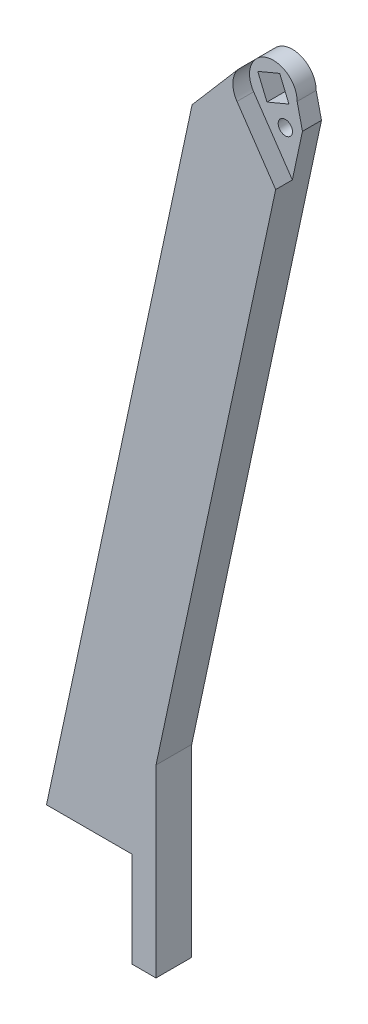
ISO-10303-21;
HEADER;
FILE_DESCRIPTION(('STEP AP214'),'2;1');
FILE_NAME('part.step','',(''),(''),'','','');
FILE_SCHEMA(('AUTOMOTIVE_DESIGN { 1 0 10303 214 1 1 1 1 }'));
ENDSEC;
DATA;
#1=APPLICATION_CONTEXT('core data for automotive mechanical design processes');
#2=APPLICATION_PROTOCOL_DEFINITION('international standard','automotive_design',2000,#1);
#3=PRODUCT_CONTEXT('',#1,'mechanical');
#4=PRODUCT('Part','Part','',(#3));
#5=PRODUCT_RELATED_PRODUCT_CATEGORY('part','',(#4));
#6=PRODUCT_DEFINITION_FORMATION('','',#4);
#7=PRODUCT_DEFINITION_CONTEXT('part definition',#1,'design');
#8=PRODUCT_DEFINITION('design','',#6,#7);
#9=PRODUCT_DEFINITION_SHAPE('','',#8);
#10=(LENGTH_UNIT() NAMED_UNIT(*) SI_UNIT(.MILLI.,.METRE.));
#11=(NAMED_UNIT(*) PLANE_ANGLE_UNIT() SI_UNIT($,.RADIAN.));
#12=(NAMED_UNIT(*) SI_UNIT($,.STERADIAN.) SOLID_ANGLE_UNIT());
#13=UNCERTAINTY_MEASURE_WITH_UNIT(LENGTH_MEASURE(1.E-05),#10,'distance_accuracy_value','');
#14=(GEOMETRIC_REPRESENTATION_CONTEXT(3) GLOBAL_UNCERTAINTY_ASSIGNED_CONTEXT((#13)) GLOBAL_UNIT_ASSIGNED_CONTEXT((#10,
#11,#12)) REPRESENTATION_CONTEXT('',''));
#15=CARTESIAN_POINT('',(0.,0.,0.));
#16=DIRECTION('',(0.,0.,1.));
#17=DIRECTION('',(1.,0.,0.));
#18=AXIS2_PLACEMENT_3D('',#15,#16,#17);
#19=CARTESIAN_POINT('',(6.35,0.,-9.525));
#20=DIRECTION('',(0.,1.,0.));
#21=DIRECTION('',(0.,0.,-1.));
#22=AXIS2_PLACEMENT_3D('',#19,#20,#21);
#23=PLANE('',#22);
#24=DIRECTION('',(1.,0.,0.));
#25=VECTOR('',#24,1.);
#26=CARTESIAN_POINT('',(6.35,0.,0.));
#27=LINE('',#26,#25);
#28=CARTESIAN_POINT('',(0.,0.,0.));
#29=VERTEX_POINT('',#28);
#30=CARTESIAN_POINT('',(6.35,0.,0.));
#31=VERTEX_POINT('',#30);
#32=EDGE_CURVE('E218',#29,#31,#27,.T.);
#33=ORIENTED_EDGE('',*,*,#32,.F.);
#34=DIRECTION('',(0.,0.,1.));
#35=VECTOR('',#34,1.);
#36=CARTESIAN_POINT('',(0.,0.,-9.525));
#37=LINE('',#36,#35);
#38=CARTESIAN_POINT('',(0.,0.,-9.525));
#39=VERTEX_POINT('',#38);
#40=EDGE_CURVE('E246',#39,#29,#37,.T.);
#41=ORIENTED_EDGE('',*,*,#40,.F.);
#42=DIRECTION('',(1.,0.,0.));
#43=VECTOR('',#42,1.);
#44=CARTESIAN_POINT('',(6.35,0.,-9.525));
#45=LINE('',#44,#43);
#46=CARTESIAN_POINT('',(6.35,0.,-9.525));
#47=VERTEX_POINT('',#46);
#48=EDGE_CURVE('E219',#39,#47,#45,.T.);
#49=ORIENTED_EDGE('',*,*,#48,.T.);
#50=DIRECTION('',(0.,0.,1.));
#51=VECTOR('',#50,1.);
#52=CARTESIAN_POINT('',(6.35,0.,-9.525));
#53=LINE('',#52,#51);
#54=EDGE_CURVE('E11',#47,#31,#53,.T.);
#55=ORIENTED_EDGE('',*,*,#54,.T.);
#56=EDGE_LOOP('',(#33,#41,#49,#55));
#57=FACE_BOUND('',#56,.T.);
#58=ADVANCED_FACE('F43',(#57),#23,.F.);
#59=CARTESIAN_POINT('',(6.34999999999999,49.1945665449002,-9.525));
#60=DIRECTION('',(-1.,0.,0.));
#61=DIRECTION('',(0.,-1.,0.));
#62=AXIS2_PLACEMENT_3D('',#59,#60,#61);
#63=PLANE('',#62);
#64=DIRECTION('',(0.,1.,0.));
#65=VECTOR('',#64,1.);
#66=CARTESIAN_POINT('',(6.34999999999999,49.1945665449002,0.));
#67=LINE('',#66,#65);
#68=CARTESIAN_POINT('',(6.34999999999999,49.1945665449002,0.));
#69=VERTEX_POINT('',#68);
#70=EDGE_CURVE('E249',#31,#69,#67,.T.);
#71=ORIENTED_EDGE('',*,*,#70,.F.);
#72=ORIENTED_EDGE('',*,*,#54,.F.);
#73=DIRECTION('',(0.,1.,0.));
#74=VECTOR('',#73,1.);
#75=CARTESIAN_POINT('',(6.34999999999999,49.1945665449002,-9.525));
#76=LINE('',#75,#74);
#77=CARTESIAN_POINT('',(6.34999999999999,49.1945665449002,-9.525));
#78=VERTEX_POINT('',#77);
#79=EDGE_CURVE('E222',#47,#78,#76,.T.);
#80=ORIENTED_EDGE('',*,*,#79,.T.);
#81=DIRECTION('',(0.,0.,1.));
#82=VECTOR('',#81,1.);
#83=CARTESIAN_POINT('',(6.34999999999999,49.1945665449002,-9.525));
#84=LINE('',#83,#82);
#85=EDGE_CURVE('E50',#78,#69,#84,.T.);
#86=ORIENTED_EDGE('',*,*,#85,.T.);
#87=EDGE_LOOP('',(#71,#72,#80,#86));
#88=FACE_BOUND('',#87,.T.);
#89=ADVANCED_FACE('F287',(#88),#63,.F.);
#90=CARTESIAN_POINT('',(6.34999999999999,49.1945665449002,-9.525));
#91=DIRECTION('',(-0.977784225170926,0.20961395231924,0.));
#92=DIRECTION('',(-0.20961395231924,-0.977784225170926,0.));
#93=AXIS2_PLACEMENT_3D('',#90,#91,#92);
#94=PLANE('',#93);
#95=DIRECTION('',(0.,0.,1.));
#96=VECTOR('',#95,1.);
#97=CARTESIAN_POINT('',(38.2701193709427,198.09204613131,-33.258448319209));
#98=LINE('',#97,#96);
#99=CARTESIAN_POINT('',(38.2701193709427,198.09204613131,-4.445));
#100=VERTEX_POINT('',#99);
#101=CARTESIAN_POINT('',(38.2701193709427,198.09204613131,0.));
#102=VERTEX_POINT('',#101);
#103=EDGE_CURVE('E206',#100,#102,#98,.T.);
#104=ORIENTED_EDGE('',*,*,#103,.T.);
#105=DIRECTION('',(0.20961395231924,0.977784225170926,0.));
#106=VECTOR('',#105,1.);
#107=CARTESIAN_POINT('',(6.34999999999999,49.1945665449002,0.));
#108=LINE('',#107,#106);
#109=EDGE_CURVE('E252',#69,#102,#108,.T.);
#110=ORIENTED_EDGE('',*,*,#109,.F.);
#111=ORIENTED_EDGE('',*,*,#85,.F.);
#112=DIRECTION('',(0.20961395231924,0.977784225170926,0.));
#113=VECTOR('',#112,1.);
#114=CARTESIAN_POINT('',(6.34999999999999,49.1945665449002,-9.525));
#115=LINE('',#114,#113);
#116=CARTESIAN_POINT('',(40.9667691054051,210.67108269827,-9.525));
#117=VERTEX_POINT('',#116);
#118=EDGE_CURVE('E226',#78,#117,#115,.T.);
#119=ORIENTED_EDGE('',*,*,#118,.T.);
#120=DIRECTION('',(0.,0.,1.));
#121=VECTOR('',#120,1.);
#122=CARTESIAN_POINT('',(40.9667691054051,210.67108269827,-9.525));
#123=LINE('',#122,#121);
#124=CARTESIAN_POINT('',(40.9667691054051,210.67108269827,-4.445));
#125=VERTEX_POINT('',#124);
#126=EDGE_CURVE('E282',#117,#125,#123,.T.);
#127=ORIENTED_EDGE('',*,*,#126,.T.);
#128=DIRECTION('',(-0.20961395231924,-0.977784225170926,0.));
#129=VECTOR('',#128,1.);
#130=CARTESIAN_POINT('',(40.9667691054051,210.67108269827,-4.445));
#131=LINE('',#130,#129);
#132=EDGE_CURVE('E203',#125,#100,#131,.T.);
#133=ORIENTED_EDGE('',*,*,#132,.T.);
#134=EDGE_LOOP('',(#104,#110,#111,#119,#127,#133));
#135=FACE_BOUND('',#134,.T.);
#136=ADVANCED_FACE('F299',(#135),#94,.F.);
#137=CARTESIAN_POINT('',(40.9667691054051,210.67108269827,-9.525));
#138=DIRECTION('',(-0.974859181454216,-0.222821848871282,0.));
#139=DIRECTION('',(0.222821848871282,-0.974859181454216,0.));
#140=AXIS2_PLACEMENT_3D('',#137,#138,#139);
#141=PLANE('',#140);
#142=ORIENTED_EDGE('',*,*,#126,.F.);
#143=DIRECTION('',(-0.222821848871282,0.974859181454216,0.));
#144=VECTOR('',#143,1.);
#145=CARTESIAN_POINT('',(40.9667691054051,210.67108269827,-9.525));
#146=LINE('',#145,#144);
#147=CARTESIAN_POINT('',(39.5518503650725,216.861438500504,-9.525));
#148=VERTEX_POINT('',#147);
#149=EDGE_CURVE('E229',#117,#148,#146,.T.);
#150=ORIENTED_EDGE('',*,*,#149,.T.);
#151=DIRECTION('',(0.,0.,1.));
#152=VECTOR('',#151,1.);
#153=CARTESIAN_POINT('',(39.5518503650725,216.861438500504,-9.525));
#154=LINE('',#153,#152);
#155=CARTESIAN_POINT('',(39.5518503650725,216.861438500504,-4.445));
#156=VERTEX_POINT('',#155);
#157=EDGE_CURVE('E279',#148,#156,#154,.T.);
#158=ORIENTED_EDGE('',*,*,#157,.T.);
#159=DIRECTION('',(0.222821848871279,-0.974859181454217,0.));
#160=VECTOR('',#159,1.);
#161=CARTESIAN_POINT('',(40.9667691054051,210.67108269827,-4.445));
#162=LINE('',#161,#160);
#163=EDGE_CURVE('E207',#156,#125,#162,.T.);
#164=ORIENTED_EDGE('',*,*,#163,.T.);
#165=EDGE_LOOP('',(#142,#150,#158,#164));
#166=FACE_BOUND('',#165,.T.);
#167=ADVANCED_FACE('F303',(#166),#141,.F.);
#168=CARTESIAN_POINT('',(33.2018503650725,216.861438500504,-9.525));
#169=DIRECTION('',(0.,0.,1.));
#170=DIRECTION('',(-1.,0.,0.));
#171=AXIS2_PLACEMENT_3D('',#168,#169,#170);
#172=CYLINDRICAL_SURFACE('',#171,6.34999999999999);
#173=ORIENTED_EDGE('',*,*,#157,.F.);
#174=CARTESIAN_POINT('',(33.2018503650725,216.861438500504,-9.525));
#175=DIRECTION('',(0.,0.,1.));
#176=DIRECTION('',(1.,0.,0.));
#177=AXIS2_PLACEMENT_3D('',#174,#175,#176);
#178=CIRCLE('',#177,6.34999999999999);
#179=CARTESIAN_POINT('',(28.3843925870198,220.998418142306,-9.525));
#180=VERTEX_POINT('',#179);
#181=EDGE_CURVE('E232',#148,#180,#178,.T.);
#182=ORIENTED_EDGE('',*,*,#181,.T.);
#183=DIRECTION('',(0.,0.,1.));
#184=VECTOR('',#183,1.);
#185=CARTESIAN_POINT('',(28.3843925870198,220.998418142306,-9.525));
#186=LINE('',#185,#184);
#187=CARTESIAN_POINT('',(28.3843925870198,220.998418142306,-4.445));
#188=VERTEX_POINT('',#187);
#189=EDGE_CURVE('E276',#180,#188,#186,.T.);
#190=ORIENTED_EDGE('',*,*,#189,.T.);
#191=CARTESIAN_POINT('',(33.2018503650725,216.861438500504,-4.445));
#192=DIRECTION('',(0.,0.,1.));
#193=DIRECTION('',(1.,0.,0.));
#194=AXIS2_PLACEMENT_3D('',#191,#192,#193);
#195=CIRCLE('',#194,6.35);
#196=EDGE_CURVE('E211',#188,#156,#195,.F.);
#197=ORIENTED_EDGE('',*,*,#196,.T.);
#198=EDGE_LOOP('',(#173,#182,#190,#197));
#199=FACE_BOUND('',#198,.T.);
#200=ADVANCED_FACE('F349',(#199),#172,.T.);
#201=CARTESIAN_POINT('',(15.9734536616157,206.546044808147,-9.525));
#202=DIRECTION('',(0.758654768197287,-0.651492856976591,0.));
#203=DIRECTION('',(0.651492856976591,0.758654768197287,0.));
#204=AXIS2_PLACEMENT_3D('',#201,#202,#203);
#205=PLANE('',#204);
#206=DIRECTION('',(-0.651492856976591,-0.758654768197287,0.));
#207=VECTOR('',#206,1.);
#208=CARTESIAN_POINT('',(15.9734536616157,206.546044808147,0.));
#209=LINE('',#208,#207);
#210=CARTESIAN_POINT('',(28.3843925870198,220.998418142306,0.));
#211=VERTEX_POINT('',#210);
#212=CARTESIAN_POINT('',(15.9734536616157,206.546044808147,0.));
#213=VERTEX_POINT('',#212);
#214=EDGE_CURVE('E255',#211,#213,#209,.T.);
#215=ORIENTED_EDGE('',*,*,#214,.F.);
#216=DIRECTION('',(0.,0.,1.));
#217=VECTOR('',#216,1.);
#218=CARTESIAN_POINT('',(28.3843925870197,220.998418142306,-33.258448319209));
#219=LINE('',#218,#217);
#220=EDGE_CURVE('E215',#188,#211,#219,.T.);
#221=ORIENTED_EDGE('',*,*,#220,.F.);
#222=ORIENTED_EDGE('',*,*,#189,.F.);
#223=DIRECTION('',(-0.651492856976591,-0.758654768197287,0.));
#224=VECTOR('',#223,1.);
#225=CARTESIAN_POINT('',(15.9734536616157,206.546044808147,-9.525));
#226=LINE('',#225,#224);
#227=CARTESIAN_POINT('',(15.9734536616157,206.546044808147,-9.525));
#228=VERTEX_POINT('',#227);
#229=EDGE_CURVE('E235',#180,#228,#226,.T.);
#230=ORIENTED_EDGE('',*,*,#229,.T.);
#231=DIRECTION('',(0.,0.,1.));
#232=VECTOR('',#231,1.);
#233=CARTESIAN_POINT('',(15.9734536616157,206.546044808147,-9.525));
#234=LINE('',#233,#232);
#235=EDGE_CURVE('E273',#228,#213,#234,.T.);
#236=ORIENTED_EDGE('',*,*,#235,.T.);
#237=EDGE_LOOP('',(#215,#221,#222,#230,#236));
#238=FACE_BOUND('',#237,.T.);
#239=ADVANCED_FACE('F319',(#238),#205,.F.);
#240=CARTESIAN_POINT('',(-22.86,25.4,-9.525));
#241=DIRECTION('',(0.977784225170926,-0.20961395231924,0.));
#242=DIRECTION('',(0.20961395231924,0.977784225170926,0.));
#243=AXIS2_PLACEMENT_3D('',#240,#241,#242);
#244=PLANE('',#243);
#245=DIRECTION('',(-0.20961395231924,-0.977784225170925,0.));
#246=VECTOR('',#245,1.);
#247=CARTESIAN_POINT('',(-22.86,25.4,0.));
#248=LINE('',#247,#246);
#249=CARTESIAN_POINT('',(-22.86,25.4,0.));
#250=VERTEX_POINT('',#249);
#251=EDGE_CURVE('E258',#213,#250,#248,.T.);
#252=ORIENTED_EDGE('',*,*,#251,.F.);
#253=ORIENTED_EDGE('',*,*,#235,.F.);
#254=DIRECTION('',(-0.20961395231924,-0.977784225170925,0.));
#255=VECTOR('',#254,1.);
#256=CARTESIAN_POINT('',(-22.86,25.4,-9.525));
#257=LINE('',#256,#255);
#258=CARTESIAN_POINT('',(-22.86,25.4,-9.525));
#259=VERTEX_POINT('',#258);
#260=EDGE_CURVE('E238',#228,#259,#257,.T.);
#261=ORIENTED_EDGE('',*,*,#260,.T.);
#262=DIRECTION('',(0.,0.,1.));
#263=VECTOR('',#262,1.);
#264=CARTESIAN_POINT('',(-22.86,25.4,-9.525));
#265=LINE('',#264,#263);
#266=EDGE_CURVE('E270',#259,#250,#265,.T.);
#267=ORIENTED_EDGE('',*,*,#266,.T.);
#268=EDGE_LOOP('',(#252,#253,#261,#267));
#269=FACE_BOUND('',#268,.T.);
#270=ADVANCED_FACE('F323',(#269),#244,.F.);
#271=CARTESIAN_POINT('',(0.,25.4,-9.525));
#272=DIRECTION('',(0.,1.,0.));
#273=DIRECTION('',(-1.,0.,0.));
#274=AXIS2_PLACEMENT_3D('',#271,#272,#273);
#275=PLANE('',#274);
#276=DIRECTION('',(1.,0.,0.));
#277=VECTOR('',#276,1.);
#278=CARTESIAN_POINT('',(0.,25.4,0.));
#279=LINE('',#278,#277);
#280=CARTESIAN_POINT('',(0.,25.4,0.));
#281=VERTEX_POINT('',#280);
#282=EDGE_CURVE('E261',#250,#281,#279,.T.);
#283=ORIENTED_EDGE('',*,*,#282,.F.);
#284=ORIENTED_EDGE('',*,*,#266,.F.);
#285=DIRECTION('',(1.,0.,0.));
#286=VECTOR('',#285,1.);
#287=CARTESIAN_POINT('',(0.,25.4,-9.525));
#288=LINE('',#287,#286);
#289=CARTESIAN_POINT('',(0.,25.4,-9.525));
#290=VERTEX_POINT('',#289);
#291=EDGE_CURVE('E241',#259,#290,#288,.T.);
#292=ORIENTED_EDGE('',*,*,#291,.T.);
#293=DIRECTION('',(0.,0.,1.));
#294=VECTOR('',#293,1.);
#295=CARTESIAN_POINT('',(0.,25.4,-9.525));
#296=LINE('',#295,#294);
#297=EDGE_CURVE('E267',#290,#281,#296,.T.);
#298=ORIENTED_EDGE('',*,*,#297,.T.);
#299=EDGE_LOOP('',(#283,#284,#292,#298));
#300=FACE_BOUND('',#299,.T.);
#301=ADVANCED_FACE('F326',(#300),#275,.F.);
#302=CARTESIAN_POINT('',(0.,0.,-9.525));
#303=DIRECTION('',(1.,0.,0.));
#304=DIRECTION('',(0.,0.,1.));
#305=AXIS2_PLACEMENT_3D('',#302,#303,#304);
#306=PLANE('',#305);
#307=DIRECTION('',(0.,-1.,0.));
#308=VECTOR('',#307,1.);
#309=CARTESIAN_POINT('',(0.,0.,0.));
#310=LINE('',#309,#308);
#311=EDGE_CURVE('E223',#281,#29,#310,.T.);
#312=ORIENTED_EDGE('',*,*,#311,.F.);
#313=ORIENTED_EDGE('',*,*,#297,.F.);
#314=DIRECTION('',(0.,-1.,0.));
#315=VECTOR('',#314,1.);
#316=CARTESIAN_POINT('',(0.,0.,-9.525));
#317=LINE('',#316,#315);
#318=EDGE_CURVE('E244',#290,#39,#317,.T.);
#319=ORIENTED_EDGE('',*,*,#318,.T.);
#320=ORIENTED_EDGE('',*,*,#40,.T.);
#321=EDGE_LOOP('',(#312,#313,#319,#320));
#322=FACE_BOUND('',#321,.T.);
#323=ADVANCED_FACE('F328',(#322),#306,.F.);
#324=CARTESIAN_POINT('',(33.2018503650725,216.861438500504,-9.525));
#325=DIRECTION('',(0.,0.,-1.));
#326=DIRECTION('',(1.,0.,0.));
#327=AXIS2_PLACEMENT_3D('',#324,#325,#326);
#328=PLANE('',#327);
#329=DIRECTION('',(0.921923090636118,0.387372966212084,0.));
#330=VECTOR('',#329,1.);
#331=CARTESIAN_POINT('',(34.8990470101188,221.018453480997,-9.525));
#332=LINE('',#331,#330);
#333=CARTESIAN_POINT('',(29.0448353845795,218.558635145551,-9.525));
#334=VERTEX_POINT('',#333);
#335=CARTESIAN_POINT('',(34.8990470101188,221.018453480997,-9.525));
#336=VERTEX_POINT('',#335);
#337=EDGE_CURVE('E166',#334,#336,#332,.T.);
#338=ORIENTED_EDGE('',*,*,#337,.F.);
#339=DIRECTION('',(-0.387372966212084,0.921923090636118,0.));
#340=VECTOR('',#339,1.);
#341=CARTESIAN_POINT('',(29.0448353845795,218.558635145551,-9.525));
#342=LINE('',#341,#340);
#343=CARTESIAN_POINT('',(31.5046537200262,212.704423520011,-9.525));
#344=VERTEX_POINT('',#343);
#345=EDGE_CURVE('E159',#344,#334,#342,.T.);
#346=ORIENTED_EDGE('',*,*,#345,.F.);
#347=DIRECTION('',(-0.921923090636118,-0.387372966212084,0.));
#348=VECTOR('',#347,1.);
#349=CARTESIAN_POINT('',(31.5046537200262,212.704423520011,-9.525));
#350=LINE('',#349,#348);
#351=CARTESIAN_POINT('',(37.3588653455655,215.164241855458,-9.525));
#352=VERTEX_POINT('',#351);
#353=EDGE_CURVE('E167',#352,#344,#350,.T.);
#354=ORIENTED_EDGE('',*,*,#353,.F.);
#355=DIRECTION('',(0.387372966212084,-0.921923090636118,0.));
#356=VECTOR('',#355,1.);
#357=CARTESIAN_POINT('',(37.3588653455655,215.164241855458,-9.525));
#358=LINE('',#357,#356);
#359=EDGE_CURVE('E155',#336,#352,#358,.T.);
#360=ORIENTED_EDGE('',*,*,#359,.F.);
#361=EDGE_LOOP('',(#338,#346,#354,#360));
#362=FACE_BOUND('',#361,.T.);
#363=CARTESIAN_POINT('',(36.3996142011533,209.250963387303,-9.525));
#364=DIRECTION('',(0.,0.,-1.));
#365=DIRECTION('',(-1.,0.,0.));
#366=AXIS2_PLACEMENT_3D('',#363,#364,#365);
#367=CIRCLE('',#366,1.905);
#368=CARTESIAN_POINT('',(34.4946142011533,209.250963387303,-9.525));
#369=VERTEX_POINT('',#368);
#370=EDGE_CURVE('E193',#369,#369,#367,.T.);
#371=ORIENTED_EDGE('',*,*,#370,.F.);
#372=EDGE_LOOP('',(#371));
#373=FACE_BOUND('',#372,.T.);
#374=ORIENTED_EDGE('',*,*,#48,.F.);
#375=ORIENTED_EDGE('',*,*,#318,.F.);
#376=ORIENTED_EDGE('',*,*,#291,.F.);
#377=ORIENTED_EDGE('',*,*,#260,.F.);
#378=ORIENTED_EDGE('',*,*,#229,.F.);
#379=ORIENTED_EDGE('',*,*,#181,.F.);
#380=ORIENTED_EDGE('',*,*,#149,.F.);
#381=ORIENTED_EDGE('',*,*,#118,.F.);
#382=ORIENTED_EDGE('',*,*,#79,.F.);
#383=EDGE_LOOP('',(#374,#375,#376,#377,#378,#379,#380,#381,#382));
#384=FACE_BOUND('',#383,.T.);
#385=ADVANCED_FACE('F163',(#362,#373,#384),#328,.T.);
#386=CARTESIAN_POINT('',(33.2018503650725,216.861438500504,0.));
#387=DIRECTION('',(0.,0.,-1.));
#388=DIRECTION('',(1.,0.,0.));
#389=AXIS2_PLACEMENT_3D('',#386,#387,#388);
#390=PLANE('',#389);
#391=CARTESIAN_POINT('',(33.2018503650725,216.861438500504,0.));
#392=DIRECTION('',(0.,0.,-1.));
#393=DIRECTION('',(-1.,0.,0.));
#394=AXIS2_PLACEMENT_3D('',#391,#392,#393);
#395=CIRCLE('',#394,6.35);
#396=CARTESIAN_POINT('',(27.9483164232422,213.294523710095,0.));
#397=VERTEX_POINT('',#396);
#398=EDGE_CURVE('E196',#397,#211,#395,.T.);
#399=ORIENTED_EDGE('',*,*,#398,.T.);
#400=ORIENTED_EDGE('',*,*,#214,.T.);
#401=ORIENTED_EDGE('',*,*,#251,.T.);
#402=ORIENTED_EDGE('',*,*,#282,.T.);
#403=ORIENTED_EDGE('',*,*,#311,.T.);
#404=ORIENTED_EDGE('',*,*,#32,.T.);
#405=ORIENTED_EDGE('',*,*,#70,.T.);
#406=ORIENTED_EDGE('',*,*,#109,.T.);
#407=DIRECTION('',(-0.56171886463131,0.827328179815792,0.));
#408=VECTOR('',#407,1.);
#409=CARTESIAN_POINT('',(38.2701193709427,198.09204613131,0.));
#410=LINE('',#409,#408);
#411=EDGE_CURVE('E187',#102,#397,#410,.T.);
#412=ORIENTED_EDGE('',*,*,#411,.T.);
#413=EDGE_LOOP('',(#399,#400,#401,#402,#403,#404,#405,#406,#412));
#414=FACE_BOUND('',#413,.T.);
#415=ADVANCED_FACE('F291',(#414),#390,.F.);
#416=CARTESIAN_POINT('',(33.2018503650725,216.861438500504,-33.258448319209));
#417=DIRECTION('',(0.,0.,1.));
#418=DIRECTION('',(-1.,0.,0.));
#419=AXIS2_PLACEMENT_3D('',#416,#417,#418);
#420=CYLINDRICAL_SURFACE('',#419,6.35);
#421=CARTESIAN_POINT('',(27.9483164232422,213.294523710095,-4.445));
#422=VERTEX_POINT('',#421);
#423=EDGE_CURVE('E209',#422,#188,#195,.F.);
#424=ORIENTED_EDGE('',*,*,#423,.T.);
#425=ORIENTED_EDGE('',*,*,#220,.T.);
#426=ORIENTED_EDGE('',*,*,#398,.F.);
#427=DIRECTION('',(0.,0.,1.));
#428=VECTOR('',#427,1.);
#429=CARTESIAN_POINT('',(27.9483164232422,213.294523710095,-33.258448319209));
#430=LINE('',#429,#428);
#431=EDGE_CURVE('E202',#422,#397,#430,.T.);
#432=ORIENTED_EDGE('',*,*,#431,.F.);
#433=EDGE_LOOP('',(#424,#425,#426,#432));
#434=FACE_BOUND('',#433,.T.);
#435=ADVANCED_FACE('F315',(#434),#420,.F.);
#436=CARTESIAN_POINT('',(33.2018503650725,216.861438500504,-4.445));
#437=DIRECTION('',(0.,0.,-1.));
#438=DIRECTION('',(0.921923090636118,0.387372966212085,0.));
#439=AXIS2_PLACEMENT_3D('',#436,#437,#438);
#440=PLANE('',#439);
#441=DIRECTION('',(0.387372966212084,-0.921923090636118,0.));
#442=VECTOR('',#441,1.);
#443=CARTESIAN_POINT('',(37.3588653455655,215.164241855458,-4.445));
#444=LINE('',#443,#442);
#445=CARTESIAN_POINT('',(34.8990470101188,221.018453480997,-4.445));
#446=VERTEX_POINT('',#445);
#447=CARTESIAN_POINT('',(37.3588653455655,215.164241855458,-4.445));
#448=VERTEX_POINT('',#447);
#449=EDGE_CURVE('E158',#446,#448,#444,.T.);
#450=ORIENTED_EDGE('',*,*,#449,.T.);
#451=DIRECTION('',(-0.921923090636118,-0.387372966212084,0.));
#452=VECTOR('',#451,1.);
#453=CARTESIAN_POINT('',(31.5046537200262,212.704423520011,-4.445));
#454=LINE('',#453,#452);
#455=CARTESIAN_POINT('',(31.5046537200262,212.704423520011,-4.445));
#456=VERTEX_POINT('',#455);
#457=EDGE_CURVE('E175',#448,#456,#454,.T.);
#458=ORIENTED_EDGE('',*,*,#457,.T.);
#459=DIRECTION('',(-0.387372966212084,0.921923090636118,0.));
#460=VECTOR('',#459,1.);
#461=CARTESIAN_POINT('',(29.0448353845795,218.558635145551,-4.445));
#462=LINE('',#461,#460);
#463=CARTESIAN_POINT('',(29.0448353845795,218.558635145551,-4.445));
#464=VERTEX_POINT('',#463);
#465=EDGE_CURVE('E172',#456,#464,#462,.T.);
#466=ORIENTED_EDGE('',*,*,#465,.T.);
#467=DIRECTION('',(0.921923090636118,0.387372966212084,0.));
#468=VECTOR('',#467,1.);
#469=CARTESIAN_POINT('',(34.8990470101188,221.018453480997,-4.445));
#470=LINE('',#469,#468);
#471=EDGE_CURVE('E180',#464,#446,#470,.T.);
#472=ORIENTED_EDGE('',*,*,#471,.T.);
#473=EDGE_LOOP('',(#450,#458,#466,#472));
#474=FACE_BOUND('',#473,.T.);
#475=CARTESIAN_POINT('',(36.3996142011533,209.250963387303,-4.445));
#476=DIRECTION('',(0.,0.,-1.));
#477=DIRECTION('',(-1.,0.,0.));
#478=AXIS2_PLACEMENT_3D('',#475,#476,#477);
#479=CIRCLE('',#478,1.905);
#480=CARTESIAN_POINT('',(34.4946142011533,209.250963387303,-4.445));
#481=VERTEX_POINT('',#480);
#482=EDGE_CURVE('E182',#481,#481,#479,.T.);
#483=ORIENTED_EDGE('',*,*,#482,.T.);
#484=EDGE_LOOP('',(#483));
#485=FACE_BOUND('',#484,.T.);
#486=ORIENTED_EDGE('',*,*,#132,.F.);
#487=ORIENTED_EDGE('',*,*,#163,.F.);
#488=ORIENTED_EDGE('',*,*,#196,.F.);
#489=ORIENTED_EDGE('',*,*,#423,.F.);
#490=DIRECTION('',(-0.56171886463131,0.827328179815792,0.));
#491=VECTOR('',#490,1.);
#492=CARTESIAN_POINT('',(38.2701193709427,198.09204613131,-4.445));
#493=LINE('',#492,#491);
#494=EDGE_CURVE('E198',#100,#422,#493,.T.);
#495=ORIENTED_EDGE('',*,*,#494,.F.);
#496=EDGE_LOOP('',(#486,#487,#488,#489,#495));
#497=FACE_BOUND('',#496,.T.);
#498=ADVANCED_FACE('F308',(#474,#485,#497),#440,.F.);
#499=CARTESIAN_POINT('',(38.2701193709427,198.09204613131,-33.258448319209));
#500=DIRECTION('',(-0.827328179815792,-0.56171886463131,0.));
#501=DIRECTION('',(0.56171886463131,-0.827328179815792,0.));
#502=AXIS2_PLACEMENT_3D('',#499,#500,#501);
#503=PLANE('',#502);
#504=ORIENTED_EDGE('',*,*,#103,.F.);
#505=ORIENTED_EDGE('',*,*,#494,.T.);
#506=ORIENTED_EDGE('',*,*,#431,.T.);
#507=ORIENTED_EDGE('',*,*,#411,.F.);
#508=EDGE_LOOP('',(#504,#505,#506,#507));
#509=FACE_BOUND('',#508,.T.);
#510=ADVANCED_FACE('F312',(#509),#503,.F.);
#511=CARTESIAN_POINT('',(36.3996142011533,209.250963387303,-9.525));
#512=DIRECTION('',(0.,0.,1.));
#513=DIRECTION('',(-1.,0.,0.));
#514=AXIS2_PLACEMENT_3D('',#511,#512,#513);
#515=CYLINDRICAL_SURFACE('',#514,1.905);
#516=ORIENTED_EDGE('',*,*,#370,.T.);
#517=EDGE_LOOP('',(#516));
#518=FACE_BOUND('',#517,.T.);
#519=ORIENTED_EDGE('',*,*,#482,.F.);
#520=EDGE_LOOP('',(#519));
#521=FACE_BOUND('',#520,.T.);
#522=ADVANCED_FACE('F411',(#518,#521),#515,.F.);
#523=CARTESIAN_POINT('',(34.8990470101188,221.018453480997,-9.525));
#524=DIRECTION('',(-0.387372966212084,0.921923090636118,0.));
#525=DIRECTION('',(-0.921923090636118,-0.387372966212084,0.));
#526=AXIS2_PLACEMENT_3D('',#523,#524,#525);
#527=PLANE('',#526);
#528=ORIENTED_EDGE('',*,*,#471,.F.);
#529=DIRECTION('',(0.,0.,1.));
#530=VECTOR('',#529,1.);
#531=CARTESIAN_POINT('',(29.0448353845795,218.558635145551,-9.525));
#532=LINE('',#531,#530);
#533=EDGE_CURVE('E170',#334,#464,#532,.T.);
#534=ORIENTED_EDGE('',*,*,#533,.F.);
#535=ORIENTED_EDGE('',*,*,#337,.T.);
#536=DIRECTION('',(0.,0.,1.));
#537=VECTOR('',#536,1.);
#538=CARTESIAN_POINT('',(34.8990470101188,221.018453480997,-9.525));
#539=LINE('',#538,#537);
#540=EDGE_CURVE('E65',#336,#446,#539,.T.);
#541=ORIENTED_EDGE('',*,*,#540,.T.);
#542=EDGE_LOOP('',(#528,#534,#535,#541));
#543=FACE_BOUND('',#542,.T.);
#544=ADVANCED_FACE('F169',(#543),#527,.F.);
#545=CARTESIAN_POINT('',(29.0448353845795,218.558635145551,-9.525));
#546=DIRECTION('',(-0.921923090636118,-0.387372966212084,0.));
#547=DIRECTION('',(0.387372966212084,-0.921923090636118,0.));
#548=AXIS2_PLACEMENT_3D('',#545,#546,#547);
#549=PLANE('',#548);
#550=ORIENTED_EDGE('',*,*,#465,.F.);
#551=DIRECTION('',(0.,0.,1.));
#552=VECTOR('',#551,1.);
#553=CARTESIAN_POINT('',(31.5046537200262,212.704423520011,-9.525));
#554=LINE('',#553,#552);
#555=EDGE_CURVE('E188',#344,#456,#554,.T.);
#556=ORIENTED_EDGE('',*,*,#555,.F.);
#557=ORIENTED_EDGE('',*,*,#345,.T.);
#558=ORIENTED_EDGE('',*,*,#533,.T.);
#559=EDGE_LOOP('',(#550,#556,#557,#558));
#560=FACE_BOUND('',#559,.T.);
#561=ADVANCED_FACE('F428',(#560),#549,.F.);
#562=CARTESIAN_POINT('',(31.5046537200262,212.704423520011,-9.525));
#563=DIRECTION('',(0.387372966212084,-0.921923090636118,0.));
#564=DIRECTION('',(0.921923090636118,0.387372966212084,0.));
#565=AXIS2_PLACEMENT_3D('',#562,#563,#564);
#566=PLANE('',#565);
#567=ORIENTED_EDGE('',*,*,#457,.F.);
#568=DIRECTION('',(0.,0.,1.));
#569=VECTOR('',#568,1.);
#570=CARTESIAN_POINT('',(37.3588653455655,215.164241855458,-9.525));
#571=LINE('',#570,#569);
#572=EDGE_CURVE('E57',#352,#448,#571,.T.);
#573=ORIENTED_EDGE('',*,*,#572,.F.);
#574=ORIENTED_EDGE('',*,*,#353,.T.);
#575=ORIENTED_EDGE('',*,*,#555,.T.);
#576=EDGE_LOOP('',(#567,#573,#574,#575));
#577=FACE_BOUND('',#576,.T.);
#578=ADVANCED_FACE('F438',(#577),#566,.F.);
#579=CARTESIAN_POINT('',(37.3588653455655,215.164241855458,-9.525));
#580=DIRECTION('',(0.921923090636118,0.387372966212084,0.));
#581=DIRECTION('',(-0.387372966212084,0.921923090636118,0.));
#582=AXIS2_PLACEMENT_3D('',#579,#580,#581);
#583=PLANE('',#582);
#584=ORIENTED_EDGE('',*,*,#449,.F.);
#585=ORIENTED_EDGE('',*,*,#540,.F.);
#586=ORIENTED_EDGE('',*,*,#359,.T.);
#587=ORIENTED_EDGE('',*,*,#572,.T.);
#588=EDGE_LOOP('',(#584,#585,#586,#587));
#589=FACE_BOUND('',#588,.T.);
#590=ADVANCED_FACE('F154',(#589),#583,.F.);
#591=CLOSED_SHELL('',(#58,#89,#136,#167,#200,#239,#270,#301,#323,#385,#415,#435,#498,#510,#522,
#544,#561,#578,#590));
#592=MANIFOLD_SOLID_BREP('B2',#591);
#593=ADVANCED_BREP_SHAPE_REPRESENTATION('',(#18,#592),#14);
#594=SHAPE_DEFINITION_REPRESENTATION(#9,#593);
ENDSEC;
END-ISO-10303-21;
